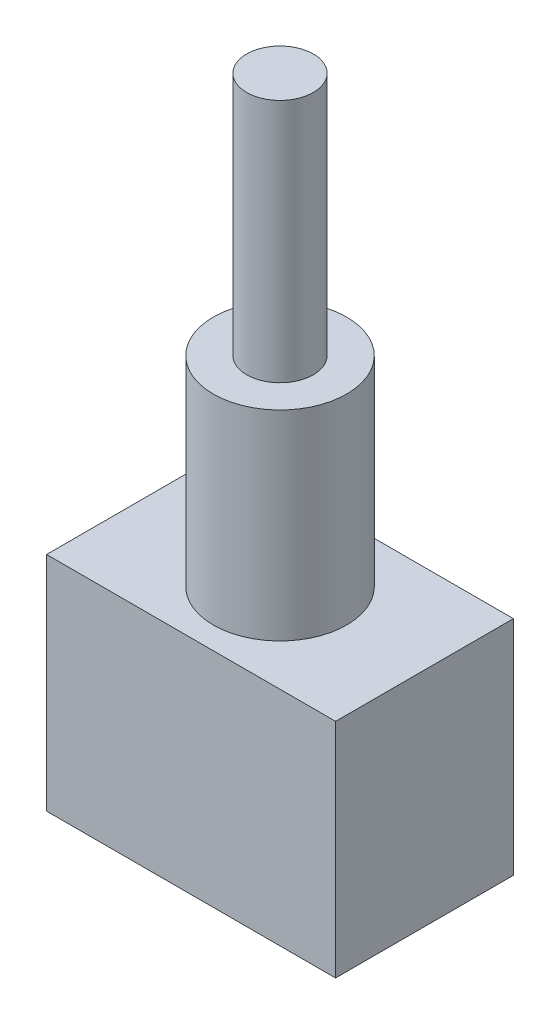
ISO-10303-21;
HEADER;
FILE_DESCRIPTION(('STEP AP214'),'2;1');
FILE_NAME('part.step','',(''),(''),'','','');
FILE_SCHEMA(('AUTOMOTIVE_DESIGN { 1 0 10303 214 1 1 1 1 }'));
ENDSEC;
DATA;
#1=APPLICATION_CONTEXT('core data for automotive mechanical design processes');
#2=APPLICATION_PROTOCOL_DEFINITION('international standard','automotive_design',2000,#1);
#3=PRODUCT_CONTEXT('',#1,'mechanical');
#4=PRODUCT('Part','Part','',(#3));
#5=PRODUCT_RELATED_PRODUCT_CATEGORY('part','',(#4));
#6=PRODUCT_DEFINITION_FORMATION('','',#4);
#7=PRODUCT_DEFINITION_CONTEXT('part definition',#1,'design');
#8=PRODUCT_DEFINITION('design','',#6,#7);
#9=PRODUCT_DEFINITION_SHAPE('','',#8);
#10=(LENGTH_UNIT() NAMED_UNIT(*) SI_UNIT(.MILLI.,.METRE.));
#11=(NAMED_UNIT(*) PLANE_ANGLE_UNIT() SI_UNIT($,.RADIAN.));
#12=(NAMED_UNIT(*) SI_UNIT($,.STERADIAN.) SOLID_ANGLE_UNIT());
#13=UNCERTAINTY_MEASURE_WITH_UNIT(LENGTH_MEASURE(1.E-05),#10,'distance_accuracy_value','');
#14=(GEOMETRIC_REPRESENTATION_CONTEXT(3) GLOBAL_UNCERTAINTY_ASSIGNED_CONTEXT((#13)) GLOBAL_UNIT_ASSIGNED_CONTEXT((#10,
#11,#12)) REPRESENTATION_CONTEXT('',''));
#15=CARTESIAN_POINT('',(0.,0.,0.));
#16=DIRECTION('',(0.,0.,1.));
#17=DIRECTION('',(1.,0.,0.));
#18=AXIS2_PLACEMENT_3D('',#15,#16,#17);
#19=CARTESIAN_POINT('',(0.,10.,0.));
#20=DIRECTION('',(1.,0.,0.));
#21=DIRECTION('',(0.,0.,-1.));
#22=AXIS2_PLACEMENT_3D('',#19,#20,#21);
#23=PLANE('',#22);
#24=DIRECTION('',(0.,0.,1.));
#25=VECTOR('',#24,1.);
#26=CARTESIAN_POINT('',(0.,0.,0.));
#27=LINE('',#26,#25);
#28=CARTESIAN_POINT('',(0.,0.,-8.));
#29=VERTEX_POINT('',#28);
#30=CARTESIAN_POINT('',(0.,0.,0.));
#31=VERTEX_POINT('',#30);
#32=EDGE_CURVE('E106',#29,#31,#27,.T.);
#33=ORIENTED_EDGE('',*,*,#32,.T.);
#34=DIRECTION('',(0.,-1.,0.));
#35=VECTOR('',#34,1.);
#36=CARTESIAN_POINT('',(0.,10.,0.));
#37=LINE('',#36,#35);
#38=CARTESIAN_POINT('',(0.,10.,0.));
#39=VERTEX_POINT('',#38);
#40=EDGE_CURVE('E42',#39,#31,#37,.T.);
#41=ORIENTED_EDGE('',*,*,#40,.F.);
#42=DIRECTION('',(0.,0.,1.));
#43=VECTOR('',#42,1.);
#44=CARTESIAN_POINT('',(0.,10.,0.));
#45=LINE('',#44,#43);
#46=CARTESIAN_POINT('',(0.,10.,-8.));
#47=VERTEX_POINT('',#46);
#48=EDGE_CURVE('E93',#47,#39,#45,.T.);
#49=ORIENTED_EDGE('',*,*,#48,.F.);
#50=DIRECTION('',(0.,-1.,0.));
#51=VECTOR('',#50,1.);
#52=CARTESIAN_POINT('',(0.,10.,-8.));
#53=LINE('',#52,#51);
#54=EDGE_CURVE('E102',#47,#29,#53,.T.);
#55=ORIENTED_EDGE('',*,*,#54,.T.);
#56=EDGE_LOOP('',(#33,#41,#49,#55));
#57=FACE_BOUND('',#56,.T.);
#58=ADVANCED_FACE('F39',(#57),#23,.F.);
#59=CARTESIAN_POINT('',(0.,10.,0.));
#60=DIRECTION('',(0.,0.,-1.));
#61=DIRECTION('',(-1.,0.,0.));
#62=AXIS2_PLACEMENT_3D('',#59,#60,#61);
#63=PLANE('',#62);
#64=DIRECTION('',(1.,0.,0.));
#65=VECTOR('',#64,1.);
#66=CARTESIAN_POINT('',(0.,0.,0.));
#67=LINE('',#66,#65);
#68=CARTESIAN_POINT('',(13.,0.,0.));
#69=VERTEX_POINT('',#68);
#70=EDGE_CURVE('E98',#31,#69,#67,.T.);
#71=ORIENTED_EDGE('',*,*,#70,.T.);
#72=DIRECTION('',(0.,-1.,0.));
#73=VECTOR('',#72,1.);
#74=CARTESIAN_POINT('',(13.,10.,0.));
#75=LINE('',#74,#73);
#76=CARTESIAN_POINT('',(13.,10.,0.));
#77=VERTEX_POINT('',#76);
#78=EDGE_CURVE('E96',#77,#69,#75,.T.);
#79=ORIENTED_EDGE('',*,*,#78,.F.);
#80=DIRECTION('',(1.,0.,0.));
#81=VECTOR('',#80,1.);
#82=CARTESIAN_POINT('',(0.,10.,0.));
#83=LINE('',#82,#81);
#84=EDGE_CURVE('E88',#39,#77,#83,.T.);
#85=ORIENTED_EDGE('',*,*,#84,.F.);
#86=ORIENTED_EDGE('',*,*,#40,.T.);
#87=EDGE_LOOP('',(#71,#79,#85,#86));
#88=FACE_BOUND('',#87,.T.);
#89=ADVANCED_FACE('F97',(#88),#63,.F.);
#90=CARTESIAN_POINT('',(13.,10.,0.));
#91=DIRECTION('',(-1.,0.,0.));
#92=DIRECTION('',(0.,0.,1.));
#93=AXIS2_PLACEMENT_3D('',#90,#91,#92);
#94=PLANE('',#93);
#95=DIRECTION('',(0.,0.,-1.));
#96=VECTOR('',#95,1.);
#97=CARTESIAN_POINT('',(13.,0.,0.));
#98=LINE('',#97,#96);
#99=CARTESIAN_POINT('',(13.,0.,-8.));
#100=VERTEX_POINT('',#99);
#101=EDGE_CURVE('E74',#69,#100,#98,.T.);
#102=ORIENTED_EDGE('',*,*,#101,.T.);
#103=DIRECTION('',(0.,-1.,0.));
#104=VECTOR('',#103,1.);
#105=CARTESIAN_POINT('',(13.,10.,-8.));
#106=LINE('',#105,#104);
#107=CARTESIAN_POINT('',(13.,10.,-8.));
#108=VERTEX_POINT('',#107);
#109=EDGE_CURVE('E99',#108,#100,#106,.T.);
#110=ORIENTED_EDGE('',*,*,#109,.F.);
#111=DIRECTION('',(0.,0.,-1.));
#112=VECTOR('',#111,1.);
#113=CARTESIAN_POINT('',(13.,10.,0.));
#114=LINE('',#113,#112);
#115=EDGE_CURVE('E91',#77,#108,#114,.T.);
#116=ORIENTED_EDGE('',*,*,#115,.F.);
#117=ORIENTED_EDGE('',*,*,#78,.T.);
#118=EDGE_LOOP('',(#102,#110,#116,#117));
#119=FACE_BOUND('',#118,.T.);
#120=ADVANCED_FACE('F100',(#119),#94,.F.);
#121=CARTESIAN_POINT('',(0.,10.,-8.));
#122=DIRECTION('',(0.,0.,1.));
#123=DIRECTION('',(1.,0.,0.));
#124=AXIS2_PLACEMENT_3D('',#121,#122,#123);
#125=PLANE('',#124);
#126=DIRECTION('',(-1.,0.,0.));
#127=VECTOR('',#126,1.);
#128=CARTESIAN_POINT('',(0.,0.,-8.));
#129=LINE('',#128,#127);
#130=EDGE_CURVE('E80',#100,#29,#129,.T.);
#131=ORIENTED_EDGE('',*,*,#130,.T.);
#132=ORIENTED_EDGE('',*,*,#54,.F.);
#133=DIRECTION('',(-1.,0.,0.));
#134=VECTOR('',#133,1.);
#135=CARTESIAN_POINT('',(0.,10.,-8.));
#136=LINE('',#135,#134);
#137=EDGE_CURVE('E57',#108,#47,#136,.T.);
#138=ORIENTED_EDGE('',*,*,#137,.F.);
#139=ORIENTED_EDGE('',*,*,#109,.T.);
#140=EDGE_LOOP('',(#131,#132,#138,#139));
#141=FACE_BOUND('',#140,.T.);
#142=ADVANCED_FACE('F114',(#141),#125,.F.);
#143=CARTESIAN_POINT('',(0.,10.,0.));
#144=DIRECTION('',(0.,-1.,0.));
#145=DIRECTION('',(0.,0.,-1.));
#146=AXIS2_PLACEMENT_3D('',#143,#144,#145);
#147=PLANE('',#146);
#148=CARTESIAN_POINT('',(6.5,10.,-4.));
#149=DIRECTION('',(0.,1.,0.));
#150=DIRECTION('',(0.,0.,1.));
#151=AXIS2_PLACEMENT_3D('',#148,#149,#150);
#152=CIRCLE('',#151,3.);
#153=CARTESIAN_POINT('',(6.5,10.,-1.));
#154=VERTEX_POINT('',#153);
#155=EDGE_CURVE('E48',#154,#154,#152,.T.);
#156=ORIENTED_EDGE('',*,*,#155,.F.);
#157=EDGE_LOOP('',(#156));
#158=FACE_BOUND('',#157,.T.);
#159=ORIENTED_EDGE('',*,*,#48,.T.);
#160=ORIENTED_EDGE('',*,*,#84,.T.);
#161=ORIENTED_EDGE('',*,*,#115,.T.);
#162=ORIENTED_EDGE('',*,*,#137,.T.);
#163=EDGE_LOOP('',(#159,#160,#161,#162));
#164=FACE_BOUND('',#163,.T.);
#165=ADVANCED_FACE('F89',(#158,#164),#147,.F.);
#166=CARTESIAN_POINT('',(0.,0.,0.));
#167=DIRECTION('',(0.,-1.,0.));
#168=DIRECTION('',(0.,0.,-1.));
#169=AXIS2_PLACEMENT_3D('',#166,#167,#168);
#170=PLANE('',#169);
#171=ORIENTED_EDGE('',*,*,#32,.F.);
#172=ORIENTED_EDGE('',*,*,#130,.F.);
#173=ORIENTED_EDGE('',*,*,#101,.F.);
#174=ORIENTED_EDGE('',*,*,#70,.F.);
#175=EDGE_LOOP('',(#171,#172,#173,#174));
#176=FACE_BOUND('',#175,.T.);
#177=ADVANCED_FACE('F117',(#176),#170,.T.);
#178=CARTESIAN_POINT('',(6.5,19.,-4.));
#179=DIRECTION('',(0.,-1.,0.));
#180=DIRECTION('',(0.,0.,-1.));
#181=AXIS2_PLACEMENT_3D('',#178,#179,#180);
#182=CYLINDRICAL_SURFACE('',#181,3.);
#183=CARTESIAN_POINT('',(6.5,19.,-4.));
#184=DIRECTION('',(0.,1.,0.));
#185=DIRECTION('',(0.,0.,1.));
#186=AXIS2_PLACEMENT_3D('',#183,#184,#185);
#187=CIRCLE('',#186,3.);
#188=CARTESIAN_POINT('',(6.5,19.,-1.));
#189=VERTEX_POINT('',#188);
#190=EDGE_CURVE('E109',#189,#189,#187,.T.);
#191=ORIENTED_EDGE('',*,*,#190,.F.);
#192=EDGE_LOOP('',(#191));
#193=FACE_BOUND('',#192,.T.);
#194=ORIENTED_EDGE('',*,*,#155,.T.);
#195=EDGE_LOOP('',(#194));
#196=FACE_BOUND('',#195,.T.);
#197=ADVANCED_FACE('F139',(#193,#196),#182,.T.);
#198=CARTESIAN_POINT('',(6.5,19.,-4.));
#199=DIRECTION('',(0.,1.,0.));
#200=DIRECTION('',(0.,0.,1.));
#201=AXIS2_PLACEMENT_3D('',#198,#199,#200);
#202=PLANE('',#201);
#203=CARTESIAN_POINT('',(6.5,19.,-4.));
#204=DIRECTION('',(0.,1.,0.));
#205=DIRECTION('',(0.,0.,1.));
#206=AXIS2_PLACEMENT_3D('',#203,#204,#205);
#207=CIRCLE('',#206,1.5);
#208=CARTESIAN_POINT('',(6.5,19.,-2.5));
#209=VERTEX_POINT('',#208);
#210=EDGE_CURVE('E11',#209,#209,#207,.T.);
#211=ORIENTED_EDGE('',*,*,#210,.F.);
#212=EDGE_LOOP('',(#211));
#213=FACE_BOUND('',#212,.T.);
#214=ORIENTED_EDGE('',*,*,#190,.T.);
#215=EDGE_LOOP('',(#214));
#216=FACE_BOUND('',#215,.T.);
#217=ADVANCED_FACE('F133',(#213,#216),#202,.T.);
#218=CARTESIAN_POINT('',(6.5,30.,-4.));
#219=DIRECTION('',(0.,-1.,0.));
#220=DIRECTION('',(0.,0.,-1.));
#221=AXIS2_PLACEMENT_3D('',#218,#219,#220);
#222=CYLINDRICAL_SURFACE('',#221,1.5);
#223=CARTESIAN_POINT('',(6.5,30.,-4.));
#224=DIRECTION('',(0.,1.,0.));
#225=DIRECTION('',(0.,0.,1.));
#226=AXIS2_PLACEMENT_3D('',#223,#224,#225);
#227=CIRCLE('',#226,1.5);
#228=CARTESIAN_POINT('',(6.5,30.,-2.5));
#229=VERTEX_POINT('',#228);
#230=EDGE_CURVE('E123',#229,#229,#227,.T.);
#231=ORIENTED_EDGE('',*,*,#230,.F.);
#232=EDGE_LOOP('',(#231));
#233=FACE_BOUND('',#232,.T.);
#234=ORIENTED_EDGE('',*,*,#210,.T.);
#235=EDGE_LOOP('',(#234));
#236=FACE_BOUND('',#235,.T.);
#237=ADVANCED_FACE('F130',(#233,#236),#222,.T.);
#238=CARTESIAN_POINT('',(6.5,30.,-4.));
#239=DIRECTION('',(0.,1.,0.));
#240=DIRECTION('',(0.,0.,1.));
#241=AXIS2_PLACEMENT_3D('',#238,#239,#240);
#242=PLANE('',#241);
#243=ORIENTED_EDGE('',*,*,#230,.T.);
#244=EDGE_LOOP('',(#243));
#245=FACE_BOUND('',#244,.T.);
#246=ADVANCED_FACE('F128',(#245),#242,.T.);
#247=CLOSED_SHELL('',(#58,#89,#120,#142,#165,#177,#197,#217,#237,#246));
#248=MANIFOLD_SOLID_BREP('B2',#247);
#249=ADVANCED_BREP_SHAPE_REPRESENTATION('',(#18,#248),#14);
#250=SHAPE_DEFINITION_REPRESENTATION(#9,#249);
ENDSEC;
END-ISO-10303-21;
